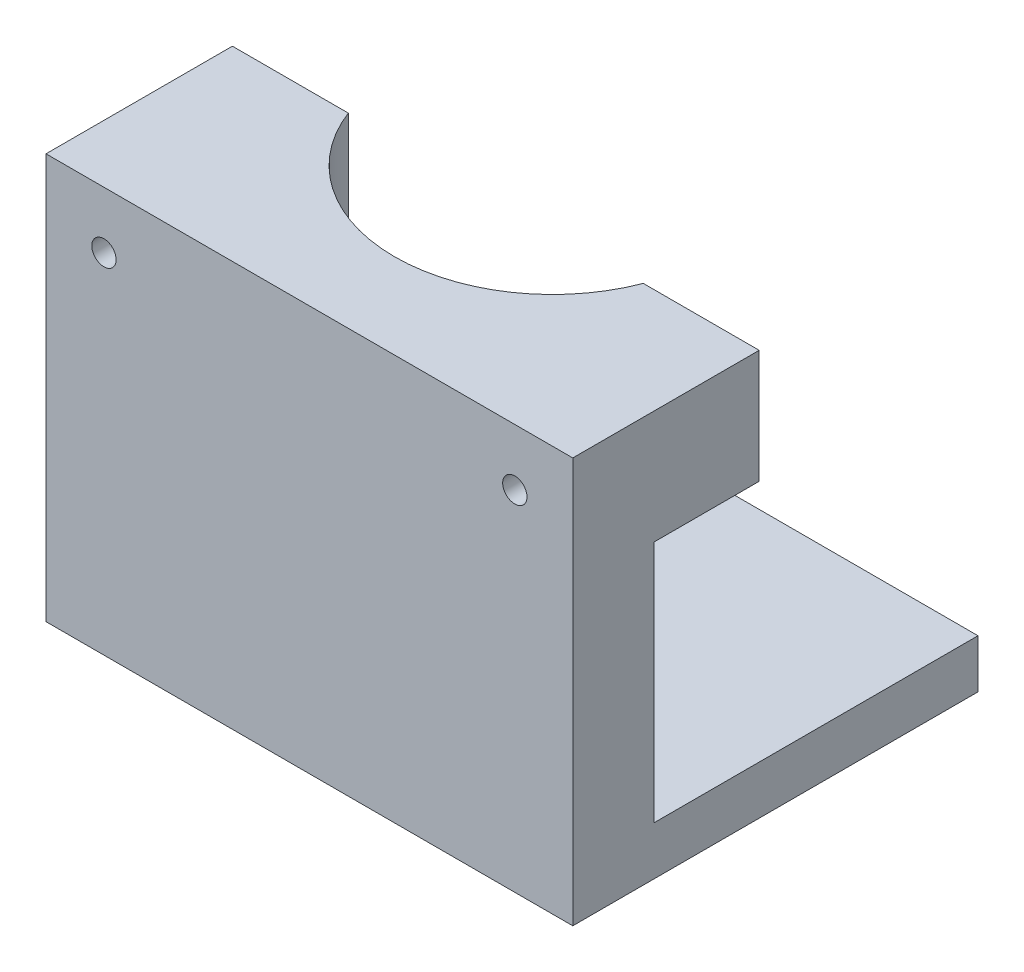
ISO-10303-21;
HEADER;
FILE_DESCRIPTION(('STEP AP214'),'2;1');
FILE_NAME('part.step','',(''),(''),'','','');
FILE_SCHEMA(('AUTOMOTIVE_DESIGN { 1 0 10303 214 1 1 1 1 }'));
ENDSEC;
DATA;
#1=APPLICATION_CONTEXT('core data for automotive mechanical design processes');
#2=APPLICATION_PROTOCOL_DEFINITION('international standard','automotive_design',2000,#1);
#3=PRODUCT_CONTEXT('',#1,'mechanical');
#4=PRODUCT('Part','Part','',(#3));
#5=PRODUCT_RELATED_PRODUCT_CATEGORY('part','',(#4));
#6=PRODUCT_DEFINITION_FORMATION('','',#4);
#7=PRODUCT_DEFINITION_CONTEXT('part definition',#1,'design');
#8=PRODUCT_DEFINITION('design','',#6,#7);
#9=PRODUCT_DEFINITION_SHAPE('','',#8);
#10=(LENGTH_UNIT() NAMED_UNIT(*) SI_UNIT(.MILLI.,.METRE.));
#11=(NAMED_UNIT(*) PLANE_ANGLE_UNIT() SI_UNIT($,.RADIAN.));
#12=(NAMED_UNIT(*) SI_UNIT($,.STERADIAN.) SOLID_ANGLE_UNIT());
#13=UNCERTAINTY_MEASURE_WITH_UNIT(LENGTH_MEASURE(1.E-05),#10,'distance_accuracy_value','');
#14=(GEOMETRIC_REPRESENTATION_CONTEXT(3) GLOBAL_UNCERTAINTY_ASSIGNED_CONTEXT((#13)) GLOBAL_UNIT_ASSIGNED_CONTEXT((#10,
#11,#12)) REPRESENTATION_CONTEXT('',''));
#15=CARTESIAN_POINT('',(0.,0.,0.));
#16=DIRECTION('',(0.,0.,1.));
#17=DIRECTION('',(1.,0.,0.));
#18=AXIS2_PLACEMENT_3D('',#15,#16,#17);
#19=CARTESIAN_POINT('',(0.,6.,-50.));
#20=DIRECTION('',(1.,0.,0.));
#21=DIRECTION('',(0.,0.,-1.));
#22=AXIS2_PLACEMENT_3D('',#19,#20,#21);
#23=PLANE('',#22);
#24=DIRECTION('',(0.,0.,1.));
#25=VECTOR('',#24,1.);
#26=CARTESIAN_POINT('',(0.,0.,-50.));
#27=LINE('',#26,#25);
#28=CARTESIAN_POINT('',(0.,0.,-50.));
#29=VERTEX_POINT('',#28);
#30=CARTESIAN_POINT('',(0.,0.,0.));
#31=VERTEX_POINT('',#30);
#32=EDGE_CURVE('E96',#29,#31,#27,.T.);
#33=ORIENTED_EDGE('',*,*,#32,.T.);
#34=DIRECTION('',(0.,-1.,0.));
#35=VECTOR('',#34,1.);
#36=CARTESIAN_POINT('',(0.,6.,0.));
#37=LINE('',#36,#35);
#38=CARTESIAN_POINT('',(0.,50.,0.));
#39=VERTEX_POINT('',#38);
#40=EDGE_CURVE('E11',#39,#31,#37,.T.);
#41=ORIENTED_EDGE('',*,*,#40,.F.);
#42=DIRECTION('',(0.,0.,1.));
#43=VECTOR('',#42,1.);
#44=CARTESIAN_POINT('',(0.,50.,0.));
#45=LINE('',#44,#43);
#46=CARTESIAN_POINT('',(0.,50.,-23.));
#47=VERTEX_POINT('',#46);
#48=EDGE_CURVE('E141',#47,#39,#45,.T.);
#49=ORIENTED_EDGE('',*,*,#48,.F.);
#50=DIRECTION('',(0.,-1.,0.));
#51=VECTOR('',#50,1.);
#52=CARTESIAN_POINT('',(0.,50.,-23.));
#53=LINE('',#52,#51);
#54=CARTESIAN_POINT('',(0.,36.,-23.));
#55=VERTEX_POINT('',#54);
#56=EDGE_CURVE('E161',#47,#55,#53,.T.);
#57=ORIENTED_EDGE('',*,*,#56,.T.);
#58=DIRECTION('',(0.,0.,1.));
#59=VECTOR('',#58,1.);
#60=CARTESIAN_POINT('',(0.,36.,0.));
#61=LINE('',#60,#59);
#62=CARTESIAN_POINT('',(0.,36.,-10.));
#63=VERTEX_POINT('',#62);
#64=EDGE_CURVE('E162',#55,#63,#61,.T.);
#65=ORIENTED_EDGE('',*,*,#64,.T.);
#66=DIRECTION('',(0.,-1.,0.));
#67=VECTOR('',#66,1.);
#68=CARTESIAN_POINT('',(0.,36.,-10.));
#69=LINE('',#68,#67);
#70=CARTESIAN_POINT('',(0.,6.,-10.));
#71=VERTEX_POINT('',#70);
#72=EDGE_CURVE('E109',#63,#71,#69,.T.);
#73=ORIENTED_EDGE('',*,*,#72,.T.);
#74=DIRECTION('',(0.,0.,1.));
#75=VECTOR('',#74,1.);
#76=CARTESIAN_POINT('',(0.,6.,-50.));
#77=LINE('',#76,#75);
#78=CARTESIAN_POINT('',(0.,6.,-50.));
#79=VERTEX_POINT('',#78);
#80=EDGE_CURVE('E90',#79,#71,#77,.T.);
#81=ORIENTED_EDGE('',*,*,#80,.F.);
#82=DIRECTION('',(0.,-1.,0.));
#83=VECTOR('',#82,1.);
#84=CARTESIAN_POINT('',(0.,6.,-50.));
#85=LINE('',#84,#83);
#86=EDGE_CURVE('E82',#79,#29,#85,.T.);
#87=ORIENTED_EDGE('',*,*,#86,.T.);
#88=EDGE_LOOP('',(#33,#41,#49,#57,#65,#73,#81,#87));
#89=FACE_BOUND('',#88,.T.);
#90=ADVANCED_FACE('F39',(#89),#23,.F.);
#91=CARTESIAN_POINT('',(0.,6.,0.));
#92=DIRECTION('',(0.,0.,-1.));
#93=DIRECTION('',(-1.,0.,0.));
#94=AXIS2_PLACEMENT_3D('',#91,#92,#93);
#95=PLANE('',#94);
#96=CARTESIAN_POINT('',(57.8501373616007,43.,0.));
#97=DIRECTION('',(0.,0.,-1.));
#98=DIRECTION('',(-1.,0.,0.));
#99=AXIS2_PLACEMENT_3D('',#96,#97,#98);
#100=CIRCLE('',#99,1.5);
#101=CARTESIAN_POINT('',(56.3501373616007,43.,0.));
#102=VERTEX_POINT('',#101);
#103=EDGE_CURVE('E167',#102,#102,#100,.F.);
#104=ORIENTED_EDGE('',*,*,#103,.F.);
#105=EDGE_LOOP('',(#104));
#106=FACE_BOUND('',#105,.T.);
#107=CARTESIAN_POINT('',(7.14986263839935,43.,0.));
#108=DIRECTION('',(0.,0.,-1.));
#109=DIRECTION('',(-1.,0.,0.));
#110=AXIS2_PLACEMENT_3D('',#107,#108,#109);
#111=CIRCLE('',#110,1.5);
#112=CARTESIAN_POINT('',(5.64986263839935,43.,0.));
#113=VERTEX_POINT('',#112);
#114=EDGE_CURVE('E296',#113,#113,#111,.F.);
#115=ORIENTED_EDGE('',*,*,#114,.F.);
#116=EDGE_LOOP('',(#115));
#117=FACE_BOUND('',#116,.T.);
#118=DIRECTION('',(1.,0.,0.));
#119=VECTOR('',#118,1.);
#120=CARTESIAN_POINT('',(0.,0.,0.));
#121=LINE('',#120,#119);
#122=CARTESIAN_POINT('',(65.,0.,0.));
#123=VERTEX_POINT('',#122);
#124=EDGE_CURVE('E101',#31,#123,#121,.T.);
#125=ORIENTED_EDGE('',*,*,#124,.T.);
#126=DIRECTION('',(0.,-1.,0.));
#127=VECTOR('',#126,1.);
#128=CARTESIAN_POINT('',(65.,6.,0.));
#129=LINE('',#128,#127);
#130=CARTESIAN_POINT('',(65.,50.,0.));
#131=VERTEX_POINT('',#130);
#132=EDGE_CURVE('E47',#131,#123,#129,.T.);
#133=ORIENTED_EDGE('',*,*,#132,.F.);
#134=DIRECTION('',(1.,0.,0.));
#135=VECTOR('',#134,1.);
#136=CARTESIAN_POINT('',(0.,50.,0.));
#137=LINE('',#136,#135);
#138=EDGE_CURVE('E132',#39,#131,#137,.T.);
#139=ORIENTED_EDGE('',*,*,#138,.F.);
#140=ORIENTED_EDGE('',*,*,#40,.T.);
#141=EDGE_LOOP('',(#125,#133,#139,#140));
#142=FACE_BOUND('',#141,.T.);
#143=ADVANCED_FACE('F130',(#106,#117,#142),#95,.F.);
#144=CARTESIAN_POINT('',(65.,6.,-50.));
#145=DIRECTION('',(-1.,0.,0.));
#146=DIRECTION('',(0.,0.,1.));
#147=AXIS2_PLACEMENT_3D('',#144,#145,#146);
#148=PLANE('',#147);
#149=DIRECTION('',(0.,0.,-1.));
#150=VECTOR('',#149,1.);
#151=CARTESIAN_POINT('',(65.,0.,-50.));
#152=LINE('',#151,#150);
#153=CARTESIAN_POINT('',(65.,0.,-50.));
#154=VERTEX_POINT('',#153);
#155=EDGE_CURVE('E91',#123,#154,#152,.T.);
#156=ORIENTED_EDGE('',*,*,#155,.T.);
#157=DIRECTION('',(0.,-1.,0.));
#158=VECTOR('',#157,1.);
#159=CARTESIAN_POINT('',(65.,6.,-50.));
#160=LINE('',#159,#158);
#161=CARTESIAN_POINT('',(65.,6.,-50.));
#162=VERTEX_POINT('',#161);
#163=EDGE_CURVE('E85',#162,#154,#160,.T.);
#164=ORIENTED_EDGE('',*,*,#163,.F.);
#165=DIRECTION('',(0.,0.,-1.));
#166=VECTOR('',#165,1.);
#167=CARTESIAN_POINT('',(65.,6.,-50.));
#168=LINE('',#167,#166);
#169=CARTESIAN_POINT('',(65.,6.,-10.));
#170=VERTEX_POINT('',#169);
#171=EDGE_CURVE('E206',#170,#162,#168,.T.);
#172=ORIENTED_EDGE('',*,*,#171,.F.);
#173=DIRECTION('',(0.,-1.,0.));
#174=VECTOR('',#173,1.);
#175=CARTESIAN_POINT('',(65.,36.,-10.));
#176=LINE('',#175,#174);
#177=CARTESIAN_POINT('',(65.,36.,-10.));
#178=VERTEX_POINT('',#177);
#179=EDGE_CURVE('E103',#178,#170,#176,.T.);
#180=ORIENTED_EDGE('',*,*,#179,.F.);
#181=DIRECTION('',(0.,0.,-1.));
#182=VECTOR('',#181,1.);
#183=CARTESIAN_POINT('',(65.,36.,0.));
#184=LINE('',#183,#182);
#185=CARTESIAN_POINT('',(65.,36.,-23.));
#186=VERTEX_POINT('',#185);
#187=EDGE_CURVE('E166',#178,#186,#184,.T.);
#188=ORIENTED_EDGE('',*,*,#187,.T.);
#189=DIRECTION('',(0.,-1.,0.));
#190=VECTOR('',#189,1.);
#191=CARTESIAN_POINT('',(65.,50.,-23.));
#192=LINE('',#191,#190);
#193=CARTESIAN_POINT('',(65.,50.,-23.));
#194=VERTEX_POINT('',#193);
#195=EDGE_CURVE('E193',#194,#186,#192,.T.);
#196=ORIENTED_EDGE('',*,*,#195,.F.);
#197=DIRECTION('',(0.,0.,-1.));
#198=VECTOR('',#197,1.);
#199=CARTESIAN_POINT('',(65.,50.,0.));
#200=LINE('',#199,#198);
#201=EDGE_CURVE('E126',#131,#194,#200,.T.);
#202=ORIENTED_EDGE('',*,*,#201,.F.);
#203=ORIENTED_EDGE('',*,*,#132,.T.);
#204=EDGE_LOOP('',(#156,#164,#172,#180,#188,#196,#202,#203));
#205=FACE_BOUND('',#204,.T.);
#206=ADVANCED_FACE('F122',(#205),#148,.F.);
#207=CARTESIAN_POINT('',(0.,6.,-50.));
#208=DIRECTION('',(0.,0.,1.));
#209=DIRECTION('',(1.,0.,0.));
#210=AXIS2_PLACEMENT_3D('',#207,#208,#209);
#211=PLANE('',#210);
#212=DIRECTION('',(-1.,0.,0.));
#213=VECTOR('',#212,1.);
#214=CARTESIAN_POINT('',(0.,0.,-50.));
#215=LINE('',#214,#213);
#216=EDGE_CURVE('E79',#154,#29,#215,.T.);
#217=ORIENTED_EDGE('',*,*,#216,.T.);
#218=ORIENTED_EDGE('',*,*,#86,.F.);
#219=DIRECTION('',(-1.,0.,0.));
#220=VECTOR('',#219,1.);
#221=CARTESIAN_POINT('',(0.,6.,-50.));
#222=LINE('',#221,#220);
#223=EDGE_CURVE('E60',#162,#79,#222,.T.);
#224=ORIENTED_EDGE('',*,*,#223,.F.);
#225=ORIENTED_EDGE('',*,*,#163,.T.);
#226=EDGE_LOOP('',(#217,#218,#224,#225));
#227=FACE_BOUND('',#226,.T.);
#228=ADVANCED_FACE('F81',(#227),#211,.F.);
#229=CARTESIAN_POINT('',(0.,6.,0.));
#230=DIRECTION('',(0.,1.,0.));
#231=DIRECTION('',(0.,0.,1.));
#232=AXIS2_PLACEMENT_3D('',#229,#230,#231);
#233=PLANE('',#232);
#234=DIRECTION('',(-1.,0.,0.));
#235=VECTOR('',#234,1.);
#236=CARTESIAN_POINT('',(0.,6.,-10.));
#237=LINE('',#236,#235);
#238=EDGE_CURVE('E54',#170,#71,#237,.T.);
#239=ORIENTED_EDGE('',*,*,#238,.F.);
#240=ORIENTED_EDGE('',*,*,#171,.T.);
#241=ORIENTED_EDGE('',*,*,#223,.T.);
#242=ORIENTED_EDGE('',*,*,#80,.T.);
#243=EDGE_LOOP('',(#239,#240,#241,#242));
#244=FACE_BOUND('',#243,.T.);
#245=ADVANCED_FACE('F209',(#244),#233,.T.);
#246=CARTESIAN_POINT('',(0.,0.,0.));
#247=DIRECTION('',(0.,1.,0.));
#248=DIRECTION('',(0.,0.,1.));
#249=AXIS2_PLACEMENT_3D('',#246,#247,#248);
#250=PLANE('',#249);
#251=ORIENTED_EDGE('',*,*,#32,.F.);
#252=ORIENTED_EDGE('',*,*,#216,.F.);
#253=ORIENTED_EDGE('',*,*,#155,.F.);
#254=ORIENTED_EDGE('',*,*,#124,.F.);
#255=EDGE_LOOP('',(#251,#252,#253,#254));
#256=FACE_BOUND('',#255,.T.);
#257=ADVANCED_FACE('F100',(#256),#250,.F.);
#258=CARTESIAN_POINT('',(0.,36.,-10.));
#259=DIRECTION('',(0.,0.,1.));
#260=DIRECTION('',(1.,0.,0.));
#261=AXIS2_PLACEMENT_3D('',#258,#259,#260);
#262=PLANE('',#261);
#263=ORIENTED_EDGE('',*,*,#238,.T.);
#264=ORIENTED_EDGE('',*,*,#72,.F.);
#265=DIRECTION('',(-1.,0.,0.));
#266=VECTOR('',#265,1.);
#267=CARTESIAN_POINT('',(0.,36.,-10.));
#268=LINE('',#267,#266);
#269=EDGE_CURVE('E197',#178,#63,#268,.T.);
#270=ORIENTED_EDGE('',*,*,#269,.F.);
#271=ORIENTED_EDGE('',*,*,#179,.T.);
#272=EDGE_LOOP('',(#263,#264,#270,#271));
#273=FACE_BOUND('',#272,.T.);
#274=ADVANCED_FACE('F213',(#273),#262,.F.);
#275=CARTESIAN_POINT('',(32.5,36.,-30.));
#276=DIRECTION('',(0.,1.,0.));
#277=DIRECTION('',(0.,0.,1.));
#278=AXIS2_PLACEMENT_3D('',#275,#276,#277);
#279=PLANE('',#278);
#280=ORIENTED_EDGE('',*,*,#187,.F.);
#281=ORIENTED_EDGE('',*,*,#269,.T.);
#282=ORIENTED_EDGE('',*,*,#64,.F.);
#283=DIRECTION('',(-1.,0.,0.));
#284=VECTOR('',#283,1.);
#285=CARTESIAN_POINT('',(0.,36.,-23.));
#286=LINE('',#285,#284);
#287=CARTESIAN_POINT('',(14.2997252767987,36.,-23.));
#288=VERTEX_POINT('',#287);
#289=EDGE_CURVE('E148',#288,#55,#286,.T.);
#290=ORIENTED_EDGE('',*,*,#289,.F.);
#291=CARTESIAN_POINT('',(32.5,36.,-30.));
#292=DIRECTION('',(0.,-1.,0.));
#293=DIRECTION('',(0.,0.,1.));
#294=AXIS2_PLACEMENT_3D('',#291,#292,#293);
#295=CIRCLE('',#294,19.5);
#296=CARTESIAN_POINT('',(50.7002747232013,36.,-23.));
#297=VERTEX_POINT('',#296);
#298=EDGE_CURVE('E175',#297,#288,#295,.T.);
#299=ORIENTED_EDGE('',*,*,#298,.F.);
#300=DIRECTION('',(-1.,0.,0.));
#301=VECTOR('',#300,1.);
#302=CARTESIAN_POINT('',(50.7002747232013,36.,-23.));
#303=LINE('',#302,#301);
#304=EDGE_CURVE('E171',#186,#297,#303,.T.);
#305=ORIENTED_EDGE('',*,*,#304,.F.);
#306=EDGE_LOOP('',(#280,#281,#282,#290,#299,#305));
#307=FACE_BOUND('',#306,.T.);
#308=ADVANCED_FACE('F222',(#307),#279,.F.);
#309=CARTESIAN_POINT('',(50.7002747232013,50.,-23.));
#310=DIRECTION('',(0.,0.,1.));
#311=DIRECTION('',(1.,0.,0.));
#312=AXIS2_PLACEMENT_3D('',#309,#310,#311);
#313=PLANE('',#312);
#314=CARTESIAN_POINT('',(57.8501373616007,43.,-23.));
#315=DIRECTION('',(0.,0.,-1.));
#316=DIRECTION('',(-1.,0.,0.));
#317=AXIS2_PLACEMENT_3D('',#314,#315,#316);
#318=CIRCLE('',#317,1.5);
#319=CARTESIAN_POINT('',(56.3501373616007,43.,-23.));
#320=VERTEX_POINT('',#319);
#321=EDGE_CURVE('E293',#320,#320,#318,.T.);
#322=ORIENTED_EDGE('',*,*,#321,.F.);
#323=EDGE_LOOP('',(#322));
#324=FACE_BOUND('',#323,.T.);
#325=ORIENTED_EDGE('',*,*,#304,.T.);
#326=DIRECTION('',(0.,-1.,0.));
#327=VECTOR('',#326,1.);
#328=CARTESIAN_POINT('',(50.7002747232013,50.,-23.));
#329=LINE('',#328,#327);
#330=CARTESIAN_POINT('',(50.7002747232013,50.,-23.));
#331=VERTEX_POINT('',#330);
#332=EDGE_CURVE('E189',#331,#297,#329,.T.);
#333=ORIENTED_EDGE('',*,*,#332,.F.);
#334=DIRECTION('',(-1.,0.,0.));
#335=VECTOR('',#334,1.);
#336=CARTESIAN_POINT('',(50.7002747232013,50.,-23.));
#337=LINE('',#336,#335);
#338=EDGE_CURVE('E146',#194,#331,#337,.T.);
#339=ORIENTED_EDGE('',*,*,#338,.F.);
#340=ORIENTED_EDGE('',*,*,#195,.T.);
#341=EDGE_LOOP('',(#325,#333,#339,#340));
#342=FACE_BOUND('',#341,.T.);
#343=ADVANCED_FACE('F229',(#324,#342),#313,.F.);
#344=CARTESIAN_POINT('',(32.5,50.,-30.));
#345=DIRECTION('',(0.,-1.,0.));
#346=DIRECTION('',(0.,0.,-1.));
#347=AXIS2_PLACEMENT_3D('',#344,#345,#346);
#348=CYLINDRICAL_SURFACE('',#347,19.5);
#349=ORIENTED_EDGE('',*,*,#298,.T.);
#350=DIRECTION('',(0.,-1.,0.));
#351=VECTOR('',#350,1.);
#352=CARTESIAN_POINT('',(14.2997252767987,50.,-23.));
#353=LINE('',#352,#351);
#354=CARTESIAN_POINT('',(14.2997252767987,50.,-23.));
#355=VERTEX_POINT('',#354);
#356=EDGE_CURVE('E185',#355,#288,#353,.T.);
#357=ORIENTED_EDGE('',*,*,#356,.F.);
#358=CARTESIAN_POINT('',(32.5,50.,-30.));
#359=DIRECTION('',(0.,-1.,0.));
#360=DIRECTION('',(0.,0.,1.));
#361=AXIS2_PLACEMENT_3D('',#358,#359,#360);
#362=CIRCLE('',#361,19.5);
#363=EDGE_CURVE('E154',#331,#355,#362,.T.);
#364=ORIENTED_EDGE('',*,*,#363,.F.);
#365=ORIENTED_EDGE('',*,*,#332,.T.);
#366=EDGE_LOOP('',(#349,#357,#364,#365));
#367=FACE_BOUND('',#366,.T.);
#368=ADVANCED_FACE('F252',(#367),#348,.F.);
#369=CARTESIAN_POINT('',(0.,50.,-23.));
#370=DIRECTION('',(0.,0.,1.));
#371=DIRECTION('',(1.,0.,0.));
#372=AXIS2_PLACEMENT_3D('',#369,#370,#371);
#373=PLANE('',#372);
#374=CARTESIAN_POINT('',(7.14986263839935,43.,-23.));
#375=DIRECTION('',(0.,0.,-1.));
#376=DIRECTION('',(-1.,0.,0.));
#377=AXIS2_PLACEMENT_3D('',#374,#375,#376);
#378=CIRCLE('',#377,1.5);
#379=CARTESIAN_POINT('',(5.64986263839935,43.,-23.));
#380=VERTEX_POINT('',#379);
#381=EDGE_CURVE('E303',#380,#380,#378,.T.);
#382=ORIENTED_EDGE('',*,*,#381,.F.);
#383=EDGE_LOOP('',(#382));
#384=FACE_BOUND('',#383,.T.);
#385=ORIENTED_EDGE('',*,*,#289,.T.);
#386=ORIENTED_EDGE('',*,*,#56,.F.);
#387=DIRECTION('',(-1.,0.,0.));
#388=VECTOR('',#387,1.);
#389=CARTESIAN_POINT('',(0.,50.,-23.));
#390=LINE('',#389,#388);
#391=EDGE_CURVE('E158',#355,#47,#390,.T.);
#392=ORIENTED_EDGE('',*,*,#391,.F.);
#393=ORIENTED_EDGE('',*,*,#356,.T.);
#394=EDGE_LOOP('',(#385,#386,#392,#393));
#395=FACE_BOUND('',#394,.T.);
#396=ADVANCED_FACE('F253',(#384,#395),#373,.F.);
#397=CARTESIAN_POINT('',(32.5,50.,-30.));
#398=DIRECTION('',(0.,1.,0.));
#399=DIRECTION('',(0.,0.,1.));
#400=AXIS2_PLACEMENT_3D('',#397,#398,#399);
#401=PLANE('',#400);
#402=ORIENTED_EDGE('',*,*,#48,.T.);
#403=ORIENTED_EDGE('',*,*,#138,.T.);
#404=ORIENTED_EDGE('',*,*,#201,.T.);
#405=ORIENTED_EDGE('',*,*,#338,.T.);
#406=ORIENTED_EDGE('',*,*,#363,.T.);
#407=ORIENTED_EDGE('',*,*,#391,.T.);
#408=EDGE_LOOP('',(#402,#403,#404,#405,#406,#407));
#409=FACE_BOUND('',#408,.T.);
#410=ADVANCED_FACE('F137',(#409),#401,.T.);
#411=CARTESIAN_POINT('',(7.14986263839935,43.,4.24264068711929));
#412=DIRECTION('',(0.,0.,-1.));
#413=DIRECTION('',(-1.,0.,0.));
#414=AXIS2_PLACEMENT_3D('',#411,#412,#413);
#415=CYLINDRICAL_SURFACE('',#414,1.5);
#416=ORIENTED_EDGE('',*,*,#114,.T.);
#417=EDGE_LOOP('',(#416));
#418=FACE_BOUND('',#417,.T.);
#419=ORIENTED_EDGE('',*,*,#381,.T.);
#420=EDGE_LOOP('',(#419));
#421=FACE_BOUND('',#420,.T.);
#422=ADVANCED_FACE('F261',(#418,#421),#415,.F.);
#423=CARTESIAN_POINT('',(57.8501373616007,43.,4.24264068711929));
#424=DIRECTION('',(0.,0.,-1.));
#425=DIRECTION('',(-1.,0.,0.));
#426=AXIS2_PLACEMENT_3D('',#423,#424,#425);
#427=CYLINDRICAL_SURFACE('',#426,1.5);
#428=ORIENTED_EDGE('',*,*,#103,.T.);
#429=EDGE_LOOP('',(#428));
#430=FACE_BOUND('',#429,.T.);
#431=ORIENTED_EDGE('',*,*,#321,.T.);
#432=EDGE_LOOP('',(#431));
#433=FACE_BOUND('',#432,.T.);
#434=ADVANCED_FACE('F309',(#430,#433),#427,.F.);
#435=CLOSED_SHELL('',(#90,#143,#206,#228,#245,#257,#274,#308,#343,#368,#396,#410,#422,#434));
#436=MANIFOLD_SOLID_BREP('B2',#435);
#437=ADVANCED_BREP_SHAPE_REPRESENTATION('',(#18,#436),#14);
#438=SHAPE_DEFINITION_REPRESENTATION(#9,#437);
ENDSEC;
END-ISO-10303-21;
